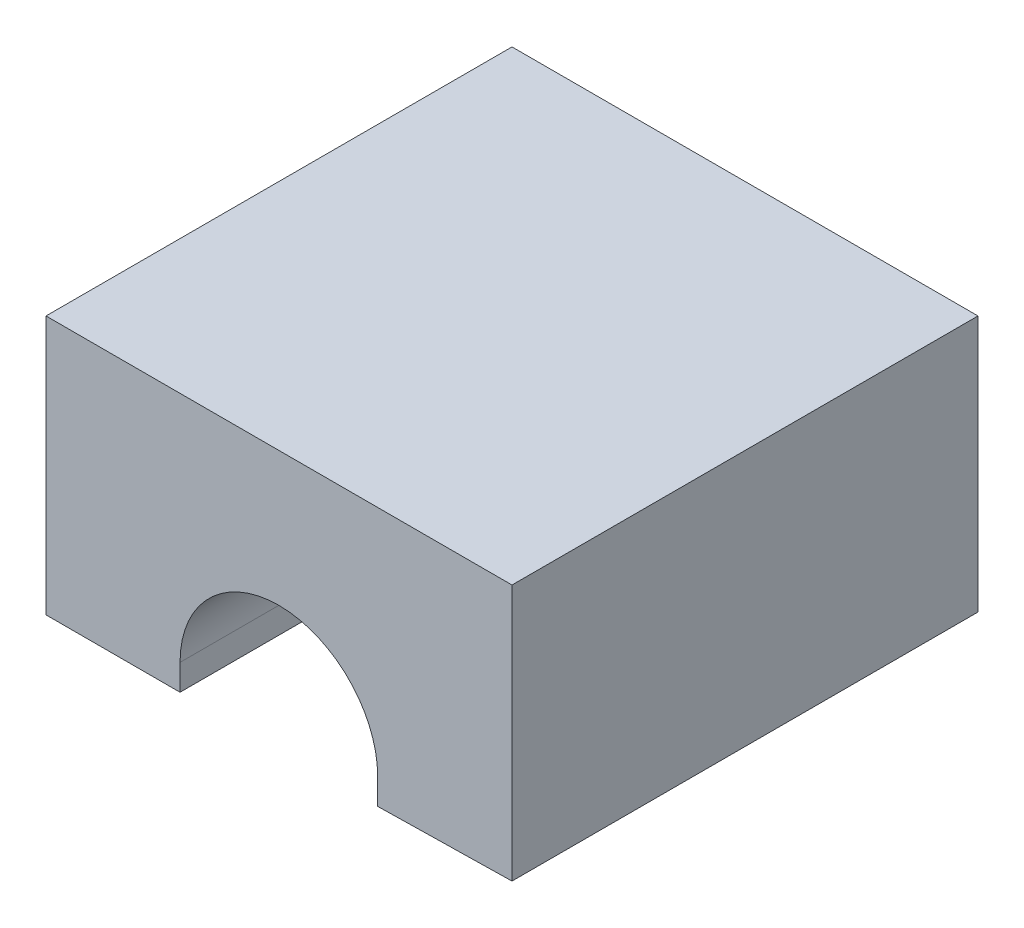
ISO-10303-21;
HEADER;
FILE_DESCRIPTION(('STEP AP214'),'2;1');
FILE_NAME('part.step','',(''),(''),'','','');
FILE_SCHEMA(('AUTOMOTIVE_DESIGN { 1 0 10303 214 1 1 1 1 }'));
ENDSEC;
DATA;
#1=APPLICATION_CONTEXT('core data for automotive mechanical design processes');
#2=APPLICATION_PROTOCOL_DEFINITION('international standard','automotive_design',2000,#1);
#3=PRODUCT_CONTEXT('',#1,'mechanical');
#4=PRODUCT('Part','Part','',(#3));
#5=PRODUCT_RELATED_PRODUCT_CATEGORY('part','',(#4));
#6=PRODUCT_DEFINITION_FORMATION('','',#4);
#7=PRODUCT_DEFINITION_CONTEXT('part definition',#1,'design');
#8=PRODUCT_DEFINITION('design','',#6,#7);
#9=PRODUCT_DEFINITION_SHAPE('','',#8);
#10=(LENGTH_UNIT() NAMED_UNIT(*) SI_UNIT(.MILLI.,.METRE.));
#11=(NAMED_UNIT(*) PLANE_ANGLE_UNIT() SI_UNIT($,.RADIAN.));
#12=(NAMED_UNIT(*) SI_UNIT($,.STERADIAN.) SOLID_ANGLE_UNIT());
#13=UNCERTAINTY_MEASURE_WITH_UNIT(LENGTH_MEASURE(1.E-05),#10,'distance_accuracy_value','');
#14=(GEOMETRIC_REPRESENTATION_CONTEXT(3) GLOBAL_UNCERTAINTY_ASSIGNED_CONTEXT((#13)) GLOBAL_UNIT_ASSIGNED_CONTEXT((#10,
#11,#12)) REPRESENTATION_CONTEXT('',''));
#15=CARTESIAN_POINT('',(0.,0.,0.));
#16=DIRECTION('',(0.,0.,1.));
#17=DIRECTION('',(1.,0.,0.));
#18=AXIS2_PLACEMENT_3D('',#15,#16,#17);
#19=CARTESIAN_POINT('',(-5.716785592021,0.207545351713,0.05));
#20=DIRECTION('',(0.,0.,1.));
#21=DIRECTION('',(1.,0.,0.));
#22=AXIS2_PLACEMENT_3D('',#19,#20,#21);
#23=PLANE('',#22);
#24=DIRECTION('',(0.,-1.,0.));
#25=VECTOR('',#24,1.);
#26=CARTESIAN_POINT('',(-5.525461,0.,0.05));
#27=LINE('',#26,#25);
#28=CARTESIAN_POINT('',(-5.525461,0.,0.05));
#29=VERTEX_POINT('',#28);
#30=CARTESIAN_POINT('',(-5.525461,-0.05,0.05));
#31=VERTEX_POINT('',#30);
#32=EDGE_CURVE('E184',#29,#31,#27,.T.);
#33=ORIENTED_EDGE('',*,*,#32,.T.);
#34=DIRECTION('',(0.999833679878257,0.0182376692892147,0.));
#35=VECTOR('',#34,1.);
#36=CARTESIAN_POINT('',(-5.525461,-0.05,0.05));
#37=LINE('',#36,#35);
#38=CARTESIAN_POINT('',(-5.2660765835,-0.0452686458737,0.05));
#39=VERTEX_POINT('',#38);
#40=EDGE_CURVE('E21',#31,#39,#37,.T.);
#41=ORIENTED_EDGE('',*,*,#40,.T.);
#42=DIRECTION('',(0.,1.,0.));
#43=VECTOR('',#42,1.);
#44=CARTESIAN_POINT('',(-5.2660765835,-0.0452686458737,0.05));
#45=LINE('',#44,#43);
#46=CARTESIAN_POINT('',(-5.2660765835,0.45,0.05));
#47=VERTEX_POINT('',#46);
#48=EDGE_CURVE('E150',#39,#47,#45,.T.);
#49=ORIENTED_EDGE('',*,*,#48,.T.);
#50=DIRECTION('',(-1.,0.,0.));
#51=VECTOR('',#50,1.);
#52=CARTESIAN_POINT('',(-5.2660765835,0.45,0.05));
#53=LINE('',#52,#51);
#54=CARTESIAN_POINT('',(-6.1660765835,0.45,0.05));
#55=VERTEX_POINT('',#54);
#56=EDGE_CURVE('E137',#47,#55,#53,.T.);
#57=ORIENTED_EDGE('',*,*,#56,.T.);
#58=DIRECTION('',(0.,-1.,0.));
#59=VECTOR('',#58,1.);
#60=CARTESIAN_POINT('',(-6.1660765835,0.45,0.05));
#61=LINE('',#60,#59);
#62=CARTESIAN_POINT('',(-6.1660765835,-0.05,0.05));
#63=VERTEX_POINT('',#62);
#64=EDGE_CURVE('E125',#55,#63,#61,.T.);
#65=ORIENTED_EDGE('',*,*,#64,.T.);
#66=DIRECTION('',(1.,0.,0.));
#67=VECTOR('',#66,1.);
#68=CARTESIAN_POINT('',(-6.1660765835,-0.05,0.05));
#69=LINE('',#68,#67);
#70=CARTESIAN_POINT('',(-5.907193,-0.05,0.05));
#71=VERTEX_POINT('',#70);
#72=EDGE_CURVE('E113',#63,#71,#69,.T.);
#73=ORIENTED_EDGE('',*,*,#72,.T.);
#74=DIRECTION('',(0.,-1.,0.));
#75=VECTOR('',#74,1.);
#76=CARTESIAN_POINT('',(-5.907193,0.,0.05));
#77=LINE('',#76,#75);
#78=CARTESIAN_POINT('',(-5.907193,0.,0.05));
#79=VERTEX_POINT('',#78);
#80=EDGE_CURVE('E154',#79,#71,#77,.T.);
#81=ORIENTED_EDGE('',*,*,#80,.F.);
#82=CARTESIAN_POINT('',(-5.716327,0.,0.05));
#83=DIRECTION('',(0.,0.,1.));
#84=DIRECTION('',(1.,0.,0.));
#85=AXIS2_PLACEMENT_3D('',#82,#83,#84);
#86=CIRCLE('',#85,0.190866);
#87=EDGE_CURVE('E28',#29,#79,#86,.T.);
#88=ORIENTED_EDGE('',*,*,#87,.F.);
#89=EDGE_LOOP('',(#33,#41,#49,#57,#65,#73,#81,#88));
#90=FACE_BOUND('',#89,.T.);
#91=ADVANCED_FACE('F17',(#90),#23,.T.);
#92=CARTESIAN_POINT('',(-5.716785592021,0.207545351713,-0.85));
#93=DIRECTION('',(0.,0.,1.));
#94=DIRECTION('',(1.,0.,0.));
#95=AXIS2_PLACEMENT_3D('',#92,#93,#94);
#96=PLANE('',#95);
#97=CARTESIAN_POINT('',(-5.716327,0.,-0.85));
#98=DIRECTION('',(0.,0.,1.));
#99=DIRECTION('',(1.,0.,0.));
#100=AXIS2_PLACEMENT_3D('',#97,#98,#99);
#101=CIRCLE('',#100,0.190866);
#102=CARTESIAN_POINT('',(-5.525461,0.,-0.85));
#103=VERTEX_POINT('',#102);
#104=CARTESIAN_POINT('',(-5.907193,0.,-0.85));
#105=VERTEX_POINT('',#104);
#106=EDGE_CURVE('E11',#103,#105,#101,.T.);
#107=ORIENTED_EDGE('',*,*,#106,.T.);
#108=DIRECTION('',(0.,-1.,0.));
#109=VECTOR('',#108,1.);
#110=CARTESIAN_POINT('',(-5.907193,0.,-0.85));
#111=LINE('',#110,#109);
#112=CARTESIAN_POINT('',(-5.907193,-0.05,-0.85));
#113=VERTEX_POINT('',#112);
#114=EDGE_CURVE('E104',#105,#113,#111,.T.);
#115=ORIENTED_EDGE('',*,*,#114,.T.);
#116=DIRECTION('',(1.,0.,0.));
#117=VECTOR('',#116,1.);
#118=CARTESIAN_POINT('',(-6.1660765835,-0.05,-0.85));
#119=LINE('',#118,#117);
#120=CARTESIAN_POINT('',(-6.1660765835,-0.05,-0.85));
#121=VERTEX_POINT('',#120);
#122=EDGE_CURVE('E118',#121,#113,#119,.T.);
#123=ORIENTED_EDGE('',*,*,#122,.F.);
#124=DIRECTION('',(0.,-1.,0.));
#125=VECTOR('',#124,1.);
#126=CARTESIAN_POINT('',(-6.1660765835,0.45,-0.85));
#127=LINE('',#126,#125);
#128=CARTESIAN_POINT('',(-6.1660765835,0.45,-0.85));
#129=VERTEX_POINT('',#128);
#130=EDGE_CURVE('E121',#129,#121,#127,.T.);
#131=ORIENTED_EDGE('',*,*,#130,.F.);
#132=DIRECTION('',(-1.,0.,0.));
#133=VECTOR('',#132,1.);
#134=CARTESIAN_POINT('',(-5.2660765835,0.45,-0.85));
#135=LINE('',#134,#133);
#136=CARTESIAN_POINT('',(-5.2660765835,0.45,-0.85));
#137=VERTEX_POINT('',#136);
#138=EDGE_CURVE('E148',#137,#129,#135,.T.);
#139=ORIENTED_EDGE('',*,*,#138,.F.);
#140=DIRECTION('',(0.,1.,0.));
#141=VECTOR('',#140,1.);
#142=CARTESIAN_POINT('',(-5.2660765835,-0.0452686458737,-0.85));
#143=LINE('',#142,#141);
#144=CARTESIAN_POINT('',(-5.2660765835,-0.0452686458737,-0.85));
#145=VERTEX_POINT('',#144);
#146=EDGE_CURVE('E160',#145,#137,#143,.T.);
#147=ORIENTED_EDGE('',*,*,#146,.F.);
#148=DIRECTION('',(0.999833679878257,0.0182376692892147,0.));
#149=VECTOR('',#148,1.);
#150=CARTESIAN_POINT('',(-5.525461,-0.05,-0.85));
#151=LINE('',#150,#149);
#152=CARTESIAN_POINT('',(-5.525461,-0.05,-0.85));
#153=VERTEX_POINT('',#152);
#154=EDGE_CURVE('E187',#153,#145,#151,.T.);
#155=ORIENTED_EDGE('',*,*,#154,.F.);
#156=DIRECTION('',(0.,-1.,0.));
#157=VECTOR('',#156,1.);
#158=CARTESIAN_POINT('',(-5.525461,0.,-0.85));
#159=LINE('',#158,#157);
#160=EDGE_CURVE('E185',#103,#153,#159,.T.);
#161=ORIENTED_EDGE('',*,*,#160,.F.);
#162=EDGE_LOOP('',(#107,#115,#123,#131,#139,#147,#155,#161));
#163=FACE_BOUND('',#162,.T.);
#164=ADVANCED_FACE('F119',(#163),#96,.F.);
#165=CARTESIAN_POINT('',(-5.716327,0.,-0.85));
#166=DIRECTION('',(0.,0.,-1.));
#167=DIRECTION('',(1.,0.,0.));
#168=AXIS2_PLACEMENT_3D('',#165,#166,#167);
#169=CYLINDRICAL_SURFACE('',#168,0.190866);
#170=DIRECTION('',(0.,0.,1.));
#171=VECTOR('',#170,1.);
#172=CARTESIAN_POINT('',(-5.525461,0.,-0.85));
#173=LINE('',#172,#171);
#174=EDGE_CURVE('E145',#103,#29,#173,.T.);
#175=ORIENTED_EDGE('',*,*,#174,.T.);
#176=ORIENTED_EDGE('',*,*,#87,.T.);
#177=DIRECTION('',(0.,0.,1.));
#178=VECTOR('',#177,1.);
#179=CARTESIAN_POINT('',(-5.907193,0.,-0.85));
#180=LINE('',#179,#178);
#181=EDGE_CURVE('E156',#105,#79,#180,.T.);
#182=ORIENTED_EDGE('',*,*,#181,.F.);
#183=ORIENTED_EDGE('',*,*,#106,.F.);
#184=EDGE_LOOP('',(#175,#176,#182,#183));
#185=FACE_BOUND('',#184,.T.);
#186=ADVANCED_FACE('F196',(#185),#169,.F.);
#187=CARTESIAN_POINT('',(-5.907193,0.,-0.85));
#188=DIRECTION('',(1.,0.,0.));
#189=DIRECTION('',(0.,1.,0.));
#190=AXIS2_PLACEMENT_3D('',#187,#188,#189);
#191=PLANE('',#190);
#192=ORIENTED_EDGE('',*,*,#181,.T.);
#193=ORIENTED_EDGE('',*,*,#80,.T.);
#194=DIRECTION('',(0.,0.,1.));
#195=VECTOR('',#194,1.);
#196=CARTESIAN_POINT('',(-5.907193,-0.05,-0.85));
#197=LINE('',#196,#195);
#198=EDGE_CURVE('E124',#113,#71,#197,.T.);
#199=ORIENTED_EDGE('',*,*,#198,.F.);
#200=ORIENTED_EDGE('',*,*,#114,.F.);
#201=EDGE_LOOP('',(#192,#193,#199,#200));
#202=FACE_BOUND('',#201,.T.);
#203=ADVANCED_FACE('F225',(#202),#191,.T.);
#204=CARTESIAN_POINT('',(-6.1660765835,-0.05,-0.85));
#205=DIRECTION('',(0.,1.,0.));
#206=DIRECTION('',(1.,0.,0.));
#207=AXIS2_PLACEMENT_3D('',#204,#205,#206);
#208=PLANE('',#207);
#209=ORIENTED_EDGE('',*,*,#122,.T.);
#210=ORIENTED_EDGE('',*,*,#198,.T.);
#211=ORIENTED_EDGE('',*,*,#72,.F.);
#212=DIRECTION('',(0.,0.,1.));
#213=VECTOR('',#212,1.);
#214=CARTESIAN_POINT('',(-6.1660765835,-0.05,-0.85));
#215=LINE('',#214,#213);
#216=EDGE_CURVE('E128',#121,#63,#215,.T.);
#217=ORIENTED_EDGE('',*,*,#216,.F.);
#218=EDGE_LOOP('',(#209,#210,#211,#217));
#219=FACE_BOUND('',#218,.T.);
#220=ADVANCED_FACE('F19',(#219),#208,.F.);
#221=CARTESIAN_POINT('',(-6.1660765835,0.45,-0.85));
#222=DIRECTION('',(1.,0.,0.));
#223=DIRECTION('',(0.,1.,0.));
#224=AXIS2_PLACEMENT_3D('',#221,#222,#223);
#225=PLANE('',#224);
#226=ORIENTED_EDGE('',*,*,#130,.T.);
#227=ORIENTED_EDGE('',*,*,#216,.T.);
#228=ORIENTED_EDGE('',*,*,#64,.F.);
#229=DIRECTION('',(0.,0.,1.));
#230=VECTOR('',#229,1.);
#231=CARTESIAN_POINT('',(-6.1660765835,0.45,-0.85));
#232=LINE('',#231,#230);
#233=EDGE_CURVE('E134',#129,#55,#232,.T.);
#234=ORIENTED_EDGE('',*,*,#233,.F.);
#235=EDGE_LOOP('',(#226,#227,#228,#234));
#236=FACE_BOUND('',#235,.T.);
#237=ADVANCED_FACE('F132',(#236),#225,.F.);
#238=CARTESIAN_POINT('',(-5.2660765835,0.45,-0.85));
#239=DIRECTION('',(0.,-1.,0.));
#240=DIRECTION('',(0.,0.,-1.));
#241=AXIS2_PLACEMENT_3D('',#238,#239,#240);
#242=PLANE('',#241);
#243=ORIENTED_EDGE('',*,*,#138,.T.);
#244=ORIENTED_EDGE('',*,*,#233,.T.);
#245=ORIENTED_EDGE('',*,*,#56,.F.);
#246=DIRECTION('',(0.,0.,1.));
#247=VECTOR('',#246,1.);
#248=CARTESIAN_POINT('',(-5.2660765835,0.45,-0.85));
#249=LINE('',#248,#247);
#250=EDGE_CURVE('E157',#137,#47,#249,.T.);
#251=ORIENTED_EDGE('',*,*,#250,.F.);
#252=EDGE_LOOP('',(#243,#244,#245,#251));
#253=FACE_BOUND('',#252,.T.);
#254=ADVANCED_FACE('F204',(#253),#242,.F.);
#255=CARTESIAN_POINT('',(-5.2660765835,-0.0452686458737,-0.85));
#256=DIRECTION('',(-1.,0.,0.));
#257=DIRECTION('',(0.,0.,1.));
#258=AXIS2_PLACEMENT_3D('',#255,#256,#257);
#259=PLANE('',#258);
#260=ORIENTED_EDGE('',*,*,#146,.T.);
#261=ORIENTED_EDGE('',*,*,#250,.T.);
#262=ORIENTED_EDGE('',*,*,#48,.F.);
#263=DIRECTION('',(0.,0.,1.));
#264=VECTOR('',#263,1.);
#265=CARTESIAN_POINT('',(-5.2660765835,-0.0452686458737,-0.85));
#266=LINE('',#265,#264);
#267=EDGE_CURVE('E175',#145,#39,#266,.T.);
#268=ORIENTED_EDGE('',*,*,#267,.F.);
#269=EDGE_LOOP('',(#260,#261,#262,#268));
#270=FACE_BOUND('',#269,.T.);
#271=ADVANCED_FACE('F202',(#270),#259,.F.);
#272=CARTESIAN_POINT('',(-5.525461,-0.05,-0.85));
#273=DIRECTION('',(-0.0182376692892147,0.999833679878257,0.));
#274=DIRECTION('',(0.,0.,1.));
#275=AXIS2_PLACEMENT_3D('',#272,#273,#274);
#276=PLANE('',#275);
#277=ORIENTED_EDGE('',*,*,#154,.T.);
#278=ORIENTED_EDGE('',*,*,#267,.T.);
#279=ORIENTED_EDGE('',*,*,#40,.F.);
#280=DIRECTION('',(0.,0.,1.));
#281=VECTOR('',#280,1.);
#282=CARTESIAN_POINT('',(-5.525461,-0.05,-0.85));
#283=LINE('',#282,#281);
#284=EDGE_CURVE('E180',#153,#31,#283,.T.);
#285=ORIENTED_EDGE('',*,*,#284,.F.);
#286=EDGE_LOOP('',(#277,#278,#279,#285));
#287=FACE_BOUND('',#286,.T.);
#288=ADVANCED_FACE('F201',(#287),#276,.F.);
#289=CARTESIAN_POINT('',(-5.525461,0.,-0.85));
#290=DIRECTION('',(1.,0.,0.));
#291=DIRECTION('',(0.,1.,0.));
#292=AXIS2_PLACEMENT_3D('',#289,#290,#291);
#293=PLANE('',#292);
#294=ORIENTED_EDGE('',*,*,#160,.T.);
#295=ORIENTED_EDGE('',*,*,#284,.T.);
#296=ORIENTED_EDGE('',*,*,#32,.F.);
#297=ORIENTED_EDGE('',*,*,#174,.F.);
#298=EDGE_LOOP('',(#294,#295,#296,#297));
#299=FACE_BOUND('',#298,.T.);
#300=ADVANCED_FACE('F200',(#299),#293,.F.);
#301=CLOSED_SHELL('',(#91,#164,#186,#203,#220,#237,#254,#271,#288,#300));
#302=MANIFOLD_SOLID_BREP('B1',#301);
#303=ADVANCED_BREP_SHAPE_REPRESENTATION('',(#18,#302),#14);
#304=SHAPE_DEFINITION_REPRESENTATION(#9,#303);
ENDSEC;
END-ISO-10303-21;
